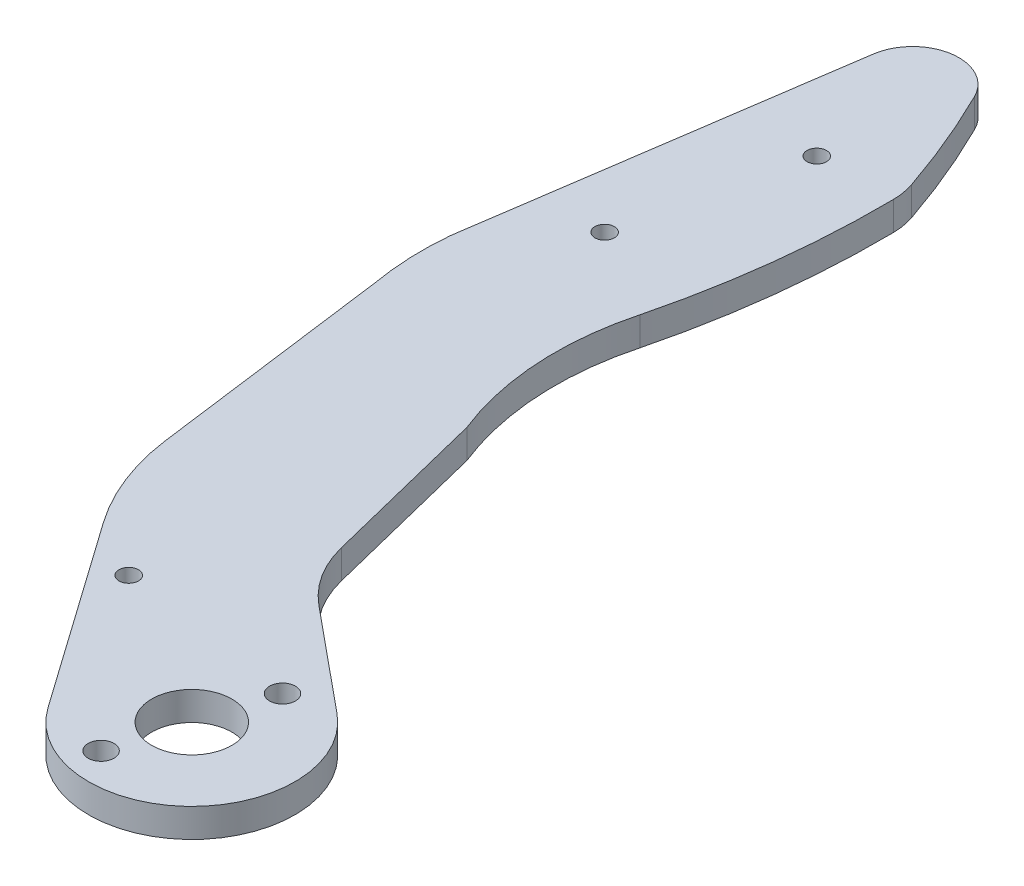
ISO-10303-21;
HEADER;
FILE_DESCRIPTION(('STEP AP214'),'2;1');
FILE_NAME('part.step','',(''),(''),'','','');
FILE_SCHEMA(('AUTOMOTIVE_DESIGN { 1 0 10303 214 1 1 1 1 }'));
ENDSEC;
DATA;
#1=APPLICATION_CONTEXT('core data for automotive mechanical design processes');
#2=APPLICATION_PROTOCOL_DEFINITION('international standard','automotive_design',2000,#1);
#3=PRODUCT_CONTEXT('',#1,'mechanical');
#4=PRODUCT('Part','Part','',(#3));
#5=PRODUCT_RELATED_PRODUCT_CATEGORY('part','',(#4));
#6=PRODUCT_DEFINITION_FORMATION('','',#4);
#7=PRODUCT_DEFINITION_CONTEXT('part definition',#1,'design');
#8=PRODUCT_DEFINITION('design','',#6,#7);
#9=PRODUCT_DEFINITION_SHAPE('','',#8);
#10=(LENGTH_UNIT() NAMED_UNIT(*) SI_UNIT(.MILLI.,.METRE.));
#11=(NAMED_UNIT(*) PLANE_ANGLE_UNIT() SI_UNIT($,.RADIAN.));
#12=(NAMED_UNIT(*) SI_UNIT($,.STERADIAN.) SOLID_ANGLE_UNIT());
#13=UNCERTAINTY_MEASURE_WITH_UNIT(LENGTH_MEASURE(1.E-05),#10,'distance_accuracy_value','');
#14=(GEOMETRIC_REPRESENTATION_CONTEXT(3) GLOBAL_UNCERTAINTY_ASSIGNED_CONTEXT((#13)) GLOBAL_UNIT_ASSIGNED_CONTEXT((#10,
#11,#12)) REPRESENTATION_CONTEXT('',''));
#15=CARTESIAN_POINT('',(0.,0.,0.));
#16=DIRECTION('',(0.,0.,1.));
#17=DIRECTION('',(1.,0.,0.));
#18=AXIS2_PLACEMENT_3D('',#15,#16,#17);
#19=CARTESIAN_POINT('',(0.,5.,0.));
#20=DIRECTION('',(0.,-1.,0.));
#21=DIRECTION('',(0.,0.,-1.));
#22=AXIS2_PLACEMENT_3D('',#19,#20,#21);
#23=PLANE('',#22);
#24=CARTESIAN_POINT('',(-3.58535968363596,5.,12.2355096313541));
#25=DIRECTION('',(0.,1.,0.));
#26=DIRECTION('',(0.,0.,1.));
#27=AXIS2_PLACEMENT_3D('',#24,#25,#26);
#28=CIRCLE('',#27,2.24999999999999);
#29=CARTESIAN_POINT('',(-3.58535968363596,5.,14.485509631354));
#30=VERTEX_POINT('',#29);
#31=EDGE_CURVE('E322',#30,#30,#28,.T.);
#32=ORIENTED_EDGE('',*,*,#31,.F.);
#33=EDGE_LOOP('',(#32));
#34=FACE_BOUND('',#33,.T.);
#35=CARTESIAN_POINT('',(3.58535968363595,5.,-12.2355096313541));
#36=DIRECTION('',(0.,1.,0.));
#37=DIRECTION('',(0.,0.,1.));
#38=AXIS2_PLACEMENT_3D('',#35,#36,#37);
#39=CIRCLE('',#38,2.24999999999999);
#40=CARTESIAN_POINT('',(3.58535968363595,5.,-9.98550963135407));
#41=VERTEX_POINT('',#40);
#42=EDGE_CURVE('E324',#41,#41,#39,.T.);
#43=ORIENTED_EDGE('',*,*,#42,.F.);
#44=EDGE_LOOP('',(#43));
#45=FACE_BOUND('',#44,.T.);
#46=CARTESIAN_POINT('',(-31.,5.,-140.));
#47=DIRECTION('',(0.,1.,0.));
#48=DIRECTION('',(0.,0.,1.));
#49=AXIS2_PLACEMENT_3D('',#46,#47,#48);
#50=CIRCLE('',#49,1.7);
#51=CARTESIAN_POINT('',(-31.,5.,-138.3));
#52=VERTEX_POINT('',#51);
#53=EDGE_CURVE('E333',#52,#52,#50,.T.);
#54=ORIENTED_EDGE('',*,*,#53,.F.);
#55=EDGE_LOOP('',(#54));
#56=FACE_BOUND('',#55,.T.);
#57=CARTESIAN_POINT('',(-38.,5.,-110.));
#58=DIRECTION('',(0.,1.,0.));
#59=DIRECTION('',(0.,0.,1.));
#60=AXIS2_PLACEMENT_3D('',#57,#58,#59);
#61=CIRCLE('',#60,1.7);
#62=CARTESIAN_POINT('',(-38.,5.,-108.3));
#63=VERTEX_POINT('',#62);
#64=EDGE_CURVE('E340',#63,#63,#61,.T.);
#65=ORIENTED_EDGE('',*,*,#64,.F.);
#66=EDGE_LOOP('',(#65));
#67=FACE_BOUND('',#66,.T.);
#68=CARTESIAN_POINT('',(0.,5.,0.));
#69=DIRECTION('',(0.,1.,0.));
#70=DIRECTION('',(0.,0.,-1.));
#71=AXIS2_PLACEMENT_3D('',#68,#69,#70);
#72=CIRCLE('',#71,18.);
#73=CARTESIAN_POINT('',(-14.7090417206775,5.,10.3751670665763));
#74=VERTEX_POINT('',#73);
#75=CARTESIAN_POINT('',(11.4464775057828,5.,-13.8916576660098));
#76=VERTEX_POINT('',#75);
#77=EDGE_CURVE('E196',#74,#76,#72,.T.);
#78=ORIENTED_EDGE('',*,*,#77,.T.);
#79=DIRECTION('',(-0.771758759222768,0.,-0.635915416987931));
#80=VECTOR('',#79,1.);
#81=CARTESIAN_POINT('',(11.4464775057828,5.,-13.8916576660098));
#82=LINE('',#81,#80);
#83=CARTESIAN_POINT('',(-6.60695362920451,5.,-28.7673620892809));
#84=VERTEX_POINT('',#83);
#85=EDGE_CURVE('E114',#76,#84,#82,.T.);
#86=ORIENTED_EDGE('',*,*,#85,.T.);
#87=CARTESIAN_POINT('',(6.11135471055411,5.,-44.2025372737363));
#88=DIRECTION('',(0.,-1.,0.));
#89=DIRECTION('',(0.,0.,-1.));
#90=AXIS2_PLACEMENT_3D('',#87,#88,#89);
#91=CIRCLE('',#90,20.);
#92=CARTESIAN_POINT('',(-13.2989437963698,5.,-39.381716609979));
#93=VERTEX_POINT('',#92);
#94=EDGE_CURVE('E229',#84,#93,#91,.T.);
#95=ORIENTED_EDGE('',*,*,#94,.T.);
#96=DIRECTION('',(-0.241041033187863,0.,-0.970514925346193));
#97=VECTOR('',#96,1.);
#98=CARTESIAN_POINT('',(-13.2989437963698,5.,-39.381716609979));
#99=LINE('',#98,#97);
#100=CARTESIAN_POINT('',(-20.5301747920056,5.,-68.4971643703648));
#101=VERTEX_POINT('',#100);
#102=EDGE_CURVE('E248',#93,#101,#99,.T.);
#103=ORIENTED_EDGE('',*,*,#102,.T.);
#104=CARTESIAN_POINT('',(26.9937980567859,5.,-87.4580042567529));
#105=DIRECTION('',(0.,-1.,0.));
#106=DIRECTION('',(0.,0.,1.));
#107=AXIS2_PLACEMENT_3D('',#104,#105,#106);
#108=CIRCLE('',#107,51.1668002178163);
#109=CARTESIAN_POINT('',(-22.4565511628832,5.,-100.599709115054));
#110=VERTEX_POINT('',#109);
#111=EDGE_CURVE('E245',#101,#110,#108,.T.);
#112=ORIENTED_EDGE('',*,*,#111,.T.);
#113=CARTESIAN_POINT('',(-171.2572125516,5.,-138.292363187831));
#114=DIRECTION('',(0.,1.,0.));
#115=DIRECTION('',(0.,0.,1.));
#116=AXIS2_PLACEMENT_3D('',#113,#114,#115);
#117=CIRCLE('',#116,153.500400653449);
#118=CARTESIAN_POINT('',(-17.7680269599981,5.,-140.147870449029));
#119=VERTEX_POINT('',#118);
#120=EDGE_CURVE('E247',#110,#119,#117,.T.);
#121=ORIENTED_EDGE('',*,*,#120,.T.);
#122=CARTESIAN_POINT('',(-30.,5.,-140.));
#123=DIRECTION('',(0.,1.,0.));
#124=DIRECTION('',(0.,0.,1.));
#125=AXIS2_PLACEMENT_3D('',#122,#123,#124);
#126=CIRCLE('',#125,12.2328667989573);
#127=CARTESIAN_POINT('',(-18.4178287610431,5.,-143.93653902718));
#128=VERTEX_POINT('',#127);
#129=EDGE_CURVE('E250',#119,#128,#126,.T.);
#130=ORIENTED_EDGE('',*,*,#129,.T.);
#131=CARTESIAN_POINT('',(-163.753174500954,5.,-94.5400788358876));
#132=DIRECTION('',(0.,1.,0.));
#133=DIRECTION('',(0.,0.,1.));
#134=AXIS2_PLACEMENT_3D('',#131,#132,#133);
#135=CIRCLE('',#134,153.500400653449);
#136=CARTESIAN_POINT('',(-26.2562949035577,5.,-162.782156044517));
#137=VERTEX_POINT('',#136);
#138=EDGE_CURVE('E256',#128,#137,#135,.T.);
#139=ORIENTED_EDGE('',*,*,#138,.T.);
#140=CARTESIAN_POINT('',(-33.4913170526785,5.,-159.191289535021));
#141=DIRECTION('',(0.,1.,0.));
#142=DIRECTION('',(0.,0.,1.));
#143=AXIS2_PLACEMENT_3D('',#140,#141,#142);
#144=CIRCLE('',#143,8.0771200181305);
#145=CARTESIAN_POINT('',(-41.4826176844214,5.,-160.365590178123));
#146=VERTEX_POINT('',#145);
#147=EDGE_CURVE('E258',#137,#146,#144,.T.);
#148=ORIENTED_EDGE('',*,*,#147,.T.);
#149=DIRECTION('',(-0.145386058454699,0.,0.989375001709163));
#150=VECTOR('',#149,1.);
#151=CARTESIAN_POINT('',(-41.4826176844214,5.,-160.365590178123));
#152=LINE('',#151,#150);
#153=CARTESIAN_POINT('',(-50.9327114839769,5.,-96.0562150670269));
#154=VERTEX_POINT('',#153);
#155=EDGE_CURVE('E260',#146,#154,#152,.T.);
#156=ORIENTED_EDGE('',*,*,#155,.T.);
#157=CARTESIAN_POINT('',(0.00716740026227708,5.,-91.2426733575386));
#158=DIRECTION('',(0.,1.,0.));
#159=DIRECTION('',(0.,0.,1.));
#160=AXIS2_PLACEMENT_3D('',#157,#158,#159);
#161=CIRCLE('',#160,51.1668002178164);
#162=CARTESIAN_POINT('',(-50.3834749970696,5.,-82.3643512573803));
#163=VERTEX_POINT('',#162);
#164=EDGE_CURVE('E151',#154,#163,#161,.T.);
#165=ORIENTED_EDGE('',*,*,#164,.T.);
#166=DIRECTION('',(0.130981717678106,0.,0.991384783842325));
#167=VECTOR('',#166,1.);
#168=CARTESIAN_POINT('',(-50.3834749970696,5.,-82.3643512573803));
#169=LINE('',#168,#167);
#170=CARTESIAN_POINT('',(-44.8192942270945,5.,-40.2497397857414));
#171=VERTEX_POINT('',#170);
#172=EDGE_CURVE('E145',#163,#171,#169,.T.);
#173=ORIENTED_EDGE('',*,*,#172,.T.);
#174=CARTESIAN_POINT('',(-5.16390287340153,5.,-45.4890084928656));
#175=DIRECTION('',(0.,1.,0.));
#176=DIRECTION('',(0.,0.,1.));
#177=AXIS2_PLACEMENT_3D('',#174,#175,#176);
#178=CIRCLE('',#177,40.);
#179=CARTESIAN_POINT('',(-37.8506622526848,5.,-22.4330816782516));
#180=VERTEX_POINT('',#179);
#181=EDGE_CURVE('E149',#171,#180,#178,.T.);
#182=ORIENTED_EDGE('',*,*,#181,.T.);
#183=DIRECTION('',(0.576398170365351,0.,0.817168984482081));
#184=VECTOR('',#183,1.);
#185=CARTESIAN_POINT('',(-37.8506622526848,5.,-22.4330816782516));
#186=LINE('',#185,#184);
#187=EDGE_CURVE('E53',#180,#74,#186,.T.);
#188=ORIENTED_EDGE('',*,*,#187,.T.);
#189=EDGE_LOOP('',(#78,#86,#95,#103,#112,#121,#130,#139,#148,#156,#165,#173,#182,#188));
#190=FACE_BOUND('',#189,.T.);
#191=CARTESIAN_POINT('',(0.,5.,0.));
#192=DIRECTION('',(0.,1.,0.));
#193=DIRECTION('',(0.,0.,1.));
#194=AXIS2_PLACEMENT_3D('',#191,#192,#193);
#195=CIRCLE('',#194,7.);
#196=CARTESIAN_POINT('',(0.,5.,7.));
#197=VERTEX_POINT('',#196);
#198=EDGE_CURVE('E173',#197,#197,#195,.T.);
#199=ORIENTED_EDGE('',*,*,#198,.F.);
#200=EDGE_LOOP('',(#199));
#201=FACE_BOUND('',#200,.T.);
#202=CARTESIAN_POINT('',(-27.6732846118374,5.,-16.6790083276029));
#203=DIRECTION('',(0.,1.,0.));
#204=DIRECTION('',(0.,0.,1.));
#205=AXIS2_PLACEMENT_3D('',#202,#203,#204);
#206=CIRCLE('',#205,1.7);
#207=CARTESIAN_POINT('',(-27.6732846118374,5.,-14.9790083276029));
#208=VERTEX_POINT('',#207);
#209=EDGE_CURVE('E345',#208,#208,#206,.T.);
#210=ORIENTED_EDGE('',*,*,#209,.F.);
#211=EDGE_LOOP('',(#210));
#212=FACE_BOUND('',#211,.T.);
#213=ADVANCED_FACE('F36',(#34,#45,#56,#67,#190,#201,#212),#23,.F.);
#214=CARTESIAN_POINT('',(0.,0.,0.));
#215=DIRECTION('',(0.,-1.,0.));
#216=DIRECTION('',(0.,0.,-1.));
#217=AXIS2_PLACEMENT_3D('',#214,#215,#216);
#218=PLANE('',#217);
#219=CARTESIAN_POINT('',(-3.58535968363596,0.,12.2355096313541));
#220=DIRECTION('',(0.,-1.,0.));
#221=DIRECTION('',(0.,0.,-1.));
#222=AXIS2_PLACEMENT_3D('',#219,#220,#221);
#223=CIRCLE('',#222,2.24999999999999);
#224=CARTESIAN_POINT('',(-3.58535968363596,0.,9.98550963135407));
#225=VERTEX_POINT('',#224);
#226=EDGE_CURVE('E320',#225,#225,#223,.T.);
#227=ORIENTED_EDGE('',*,*,#226,.F.);
#228=EDGE_LOOP('',(#227));
#229=FACE_BOUND('',#228,.T.);
#230=CARTESIAN_POINT('',(3.58535968363595,0.,-12.2355096313541));
#231=DIRECTION('',(0.,-1.,0.));
#232=DIRECTION('',(0.,0.,-1.));
#233=AXIS2_PLACEMENT_3D('',#230,#231,#232);
#234=CIRCLE('',#233,2.24999999999999);
#235=CARTESIAN_POINT('',(3.58535968363595,0.,-14.485509631354));
#236=VERTEX_POINT('',#235);
#237=EDGE_CURVE('E329',#236,#236,#234,.T.);
#238=ORIENTED_EDGE('',*,*,#237,.F.);
#239=EDGE_LOOP('',(#238));
#240=FACE_BOUND('',#239,.T.);
#241=CARTESIAN_POINT('',(-31.,0.,-140.));
#242=DIRECTION('',(0.,-1.,0.));
#243=DIRECTION('',(0.,0.,-1.));
#244=AXIS2_PLACEMENT_3D('',#241,#242,#243);
#245=CIRCLE('',#244,1.7);
#246=CARTESIAN_POINT('',(-31.,0.,-141.7));
#247=VERTEX_POINT('',#246);
#248=EDGE_CURVE('E337',#247,#247,#245,.F.);
#249=ORIENTED_EDGE('',*,*,#248,.T.);
#250=EDGE_LOOP('',(#249));
#251=FACE_BOUND('',#250,.T.);
#252=CARTESIAN_POINT('',(-38.,0.,-110.));
#253=DIRECTION('',(0.,-1.,0.));
#254=DIRECTION('',(0.,0.,-1.));
#255=AXIS2_PLACEMENT_3D('',#252,#253,#254);
#256=CIRCLE('',#255,1.7);
#257=CARTESIAN_POINT('',(-38.,0.,-111.7));
#258=VERTEX_POINT('',#257);
#259=EDGE_CURVE('E332',#258,#258,#256,.F.);
#260=ORIENTED_EDGE('',*,*,#259,.T.);
#261=EDGE_LOOP('',(#260));
#262=FACE_BOUND('',#261,.T.);
#263=CARTESIAN_POINT('',(0.,0.,0.));
#264=DIRECTION('',(0.,1.,0.));
#265=DIRECTION('',(0.,0.,1.));
#266=AXIS2_PLACEMENT_3D('',#263,#264,#265);
#267=CIRCLE('',#266,7.);
#268=CARTESIAN_POINT('',(0.,0.,7.));
#269=VERTEX_POINT('',#268);
#270=EDGE_CURVE('E348',#269,#269,#267,.T.);
#271=ORIENTED_EDGE('',*,*,#270,.T.);
#272=EDGE_LOOP('',(#271));
#273=FACE_BOUND('',#272,.T.);
#274=CARTESIAN_POINT('',(0.,0.,0.));
#275=DIRECTION('',(0.,1.,0.));
#276=DIRECTION('',(0.,0.,-1.));
#277=AXIS2_PLACEMENT_3D('',#274,#275,#276);
#278=CIRCLE('',#277,18.);
#279=CARTESIAN_POINT('',(-14.7090417206775,0.,10.3751670665763));
#280=VERTEX_POINT('',#279);
#281=CARTESIAN_POINT('',(11.4464775057828,0.,-13.8916576660098));
#282=VERTEX_POINT('',#281);
#283=EDGE_CURVE('E169',#280,#282,#278,.T.);
#284=ORIENTED_EDGE('',*,*,#283,.F.);
#285=DIRECTION('',(0.576398170365351,0.,0.817168984482081));
#286=VECTOR('',#285,1.);
#287=CARTESIAN_POINT('',(-37.8506622526848,0.,-22.4330816782516));
#288=LINE('',#287,#286);
#289=CARTESIAN_POINT('',(-37.8506622526848,0.,-22.4330816782516));
#290=VERTEX_POINT('',#289);
#291=EDGE_CURVE('E106',#290,#280,#288,.T.);
#292=ORIENTED_EDGE('',*,*,#291,.F.);
#293=CARTESIAN_POINT('',(-5.16390287340153,0.,-45.4890084928656));
#294=DIRECTION('',(0.,1.,0.));
#295=DIRECTION('',(0.,0.,1.));
#296=AXIS2_PLACEMENT_3D('',#293,#294,#295);
#297=CIRCLE('',#296,40.);
#298=CARTESIAN_POINT('',(-44.8192942270945,0.,-40.2497397857414));
#299=VERTEX_POINT('',#298);
#300=EDGE_CURVE('E100',#299,#290,#297,.T.);
#301=ORIENTED_EDGE('',*,*,#300,.F.);
#302=DIRECTION('',(0.130981717678106,0.,0.991384783842325));
#303=VECTOR('',#302,1.);
#304=CARTESIAN_POINT('',(-50.3834749970696,0.,-82.3643512573803));
#305=LINE('',#304,#303);
#306=CARTESIAN_POINT('',(-50.3834749970696,0.,-82.3643512573803));
#307=VERTEX_POINT('',#306);
#308=EDGE_CURVE('E159',#307,#299,#305,.T.);
#309=ORIENTED_EDGE('',*,*,#308,.F.);
#310=CARTESIAN_POINT('',(0.00716740026227708,0.,-91.2426733575386));
#311=DIRECTION('',(0.,1.,0.));
#312=DIRECTION('',(0.,0.,1.));
#313=AXIS2_PLACEMENT_3D('',#310,#311,#312);
#314=CIRCLE('',#313,51.1668002178164);
#315=CARTESIAN_POINT('',(-50.9327114839769,0.,-96.0562150670269));
#316=VERTEX_POINT('',#315);
#317=EDGE_CURVE('E191',#316,#307,#314,.T.);
#318=ORIENTED_EDGE('',*,*,#317,.F.);
#319=DIRECTION('',(-0.145386058454699,0.,0.989375001709163));
#320=VECTOR('',#319,1.);
#321=CARTESIAN_POINT('',(-41.4826176844214,0.,-160.365590178123));
#322=LINE('',#321,#320);
#323=CARTESIAN_POINT('',(-41.4826176844214,0.,-160.365590178123));
#324=VERTEX_POINT('',#323);
#325=EDGE_CURVE('E189',#324,#316,#322,.T.);
#326=ORIENTED_EDGE('',*,*,#325,.F.);
#327=CARTESIAN_POINT('',(-33.4913170526785,0.,-159.191289535021));
#328=DIRECTION('',(0.,1.,0.));
#329=DIRECTION('',(0.,0.,1.));
#330=AXIS2_PLACEMENT_3D('',#327,#328,#329);
#331=CIRCLE('',#330,8.0771200181305);
#332=CARTESIAN_POINT('',(-26.2562949035577,0.,-162.782156044517));
#333=VERTEX_POINT('',#332);
#334=EDGE_CURVE('E187',#333,#324,#331,.T.);
#335=ORIENTED_EDGE('',*,*,#334,.F.);
#336=CARTESIAN_POINT('',(-163.753174500954,0.,-94.5400788358876));
#337=DIRECTION('',(0.,1.,0.));
#338=DIRECTION('',(0.,0.,1.));
#339=AXIS2_PLACEMENT_3D('',#336,#337,#338);
#340=CIRCLE('',#339,153.500400653449);
#341=CARTESIAN_POINT('',(-18.4178287610431,0.,-143.93653902718));
#342=VERTEX_POINT('',#341);
#343=EDGE_CURVE('E185',#342,#333,#340,.T.);
#344=ORIENTED_EDGE('',*,*,#343,.F.);
#345=CARTESIAN_POINT('',(-30.,0.,-140.));
#346=DIRECTION('',(0.,1.,0.));
#347=DIRECTION('',(0.,0.,1.));
#348=AXIS2_PLACEMENT_3D('',#345,#346,#347);
#349=CIRCLE('',#348,12.2328667989573);
#350=CARTESIAN_POINT('',(-17.7680269599981,0.,-140.147870449029));
#351=VERTEX_POINT('',#350);
#352=EDGE_CURVE('E183',#351,#342,#349,.T.);
#353=ORIENTED_EDGE('',*,*,#352,.F.);
#354=CARTESIAN_POINT('',(-171.2572125516,0.,-138.292363187831));
#355=DIRECTION('',(0.,1.,0.));
#356=DIRECTION('',(0.,0.,1.));
#357=AXIS2_PLACEMENT_3D('',#354,#355,#356);
#358=CIRCLE('',#357,153.500400653449);
#359=CARTESIAN_POINT('',(-22.4565511628832,0.,-100.599709115054));
#360=VERTEX_POINT('',#359);
#361=EDGE_CURVE('E181',#360,#351,#358,.T.);
#362=ORIENTED_EDGE('',*,*,#361,.F.);
#363=CARTESIAN_POINT('',(26.9937980567859,0.,-87.4580042567529));
#364=DIRECTION('',(0.,-1.,0.));
#365=DIRECTION('',(0.,0.,1.));
#366=AXIS2_PLACEMENT_3D('',#363,#364,#365);
#367=CIRCLE('',#366,51.1668002178163);
#368=CARTESIAN_POINT('',(-20.5301747920056,0.,-68.4971643703648));
#369=VERTEX_POINT('',#368);
#370=EDGE_CURVE('E179',#369,#360,#367,.T.);
#371=ORIENTED_EDGE('',*,*,#370,.F.);
#372=DIRECTION('',(-0.241041033187863,0.,-0.970514925346193));
#373=VECTOR('',#372,1.);
#374=CARTESIAN_POINT('',(-13.2989437963698,0.,-39.381716609979));
#375=LINE('',#374,#373);
#376=CARTESIAN_POINT('',(-13.2989437963698,0.,-39.381716609979));
#377=VERTEX_POINT('',#376);
#378=EDGE_CURVE('E177',#377,#369,#375,.T.);
#379=ORIENTED_EDGE('',*,*,#378,.F.);
#380=CARTESIAN_POINT('',(6.11135471055411,0.,-44.2025372737363));
#381=DIRECTION('',(0.,-1.,0.));
#382=DIRECTION('',(0.,0.,-1.));
#383=AXIS2_PLACEMENT_3D('',#380,#381,#382);
#384=CIRCLE('',#383,20.);
#385=CARTESIAN_POINT('',(-6.60695362920451,0.,-28.7673620892809));
#386=VERTEX_POINT('',#385);
#387=EDGE_CURVE('E175',#386,#377,#384,.T.);
#388=ORIENTED_EDGE('',*,*,#387,.F.);
#389=DIRECTION('',(-0.771758759222768,0.,-0.635915416987931));
#390=VECTOR('',#389,1.);
#391=CARTESIAN_POINT('',(11.4464775057828,0.,-13.8916576660098));
#392=LINE('',#391,#390);
#393=EDGE_CURVE('E172',#282,#386,#392,.T.);
#394=ORIENTED_EDGE('',*,*,#393,.F.);
#395=EDGE_LOOP('',(#284,#292,#301,#309,#318,#326,#335,#344,#353,#362,#371,#379,#388,#394));
#396=FACE_BOUND('',#395,.T.);
#397=CARTESIAN_POINT('',(-27.6732846118374,0.,-16.6790083276029));
#398=DIRECTION('',(0.,1.,0.));
#399=DIRECTION('',(0.,0.,1.));
#400=AXIS2_PLACEMENT_3D('',#397,#398,#399);
#401=CIRCLE('',#400,1.7);
#402=CARTESIAN_POINT('',(-27.6732846118374,0.,-14.9790083276029));
#403=VERTEX_POINT('',#402);
#404=EDGE_CURVE('E336',#403,#403,#401,.T.);
#405=ORIENTED_EDGE('',*,*,#404,.T.);
#406=EDGE_LOOP('',(#405));
#407=FACE_BOUND('',#406,.T.);
#408=ADVANCED_FACE('F233',(#229,#240,#251,#262,#273,#396,#407),#218,.T.);
#409=CARTESIAN_POINT('',(0.,5.,0.));
#410=DIRECTION('',(0.,-1.,0.));
#411=DIRECTION('',(0.,0.,-1.));
#412=AXIS2_PLACEMENT_3D('',#409,#410,#411);
#413=CYLINDRICAL_SURFACE('',#412,18.);
#414=ORIENTED_EDGE('',*,*,#283,.T.);
#415=DIRECTION('',(0.,-1.,0.));
#416=VECTOR('',#415,1.);
#417=CARTESIAN_POINT('',(11.4464775057828,5.,-13.8916576660098));
#418=LINE('',#417,#416);
#419=EDGE_CURVE('E11',#76,#282,#418,.T.);
#420=ORIENTED_EDGE('',*,*,#419,.F.);
#421=ORIENTED_EDGE('',*,*,#77,.F.);
#422=DIRECTION('',(0.,-1.,0.));
#423=VECTOR('',#422,1.);
#424=CARTESIAN_POINT('',(-14.7090417206775,5.,10.3751670665763));
#425=LINE('',#424,#423);
#426=EDGE_CURVE('E165',#74,#280,#425,.T.);
#427=ORIENTED_EDGE('',*,*,#426,.T.);
#428=EDGE_LOOP('',(#414,#420,#421,#427));
#429=FACE_BOUND('',#428,.T.);
#430=ADVANCED_FACE('F38',(#429),#413,.T.);
#431=CARTESIAN_POINT('',(11.4464775057828,5.,-13.8916576660098));
#432=DIRECTION('',(-0.635915416987931,0.,0.771758759222768));
#433=DIRECTION('',(0.771758759222768,0.,0.635915416987931));
#434=AXIS2_PLACEMENT_3D('',#431,#432,#433);
#435=PLANE('',#434);
#436=ORIENTED_EDGE('',*,*,#393,.T.);
#437=DIRECTION('',(0.,-1.,0.));
#438=VECTOR('',#437,1.);
#439=CARTESIAN_POINT('',(-6.60695362920451,5.,-28.7673620892809));
#440=LINE('',#439,#438);
#441=EDGE_CURVE('E45',#84,#386,#440,.T.);
#442=ORIENTED_EDGE('',*,*,#441,.F.);
#443=ORIENTED_EDGE('',*,*,#85,.F.);
#444=ORIENTED_EDGE('',*,*,#419,.T.);
#445=EDGE_LOOP('',(#436,#442,#443,#444));
#446=FACE_BOUND('',#445,.T.);
#447=ADVANCED_FACE('F499',(#446),#435,.F.);
#448=CARTESIAN_POINT('',(6.11135471055411,5.,-44.2025372737363));
#449=DIRECTION('',(0.,-1.,0.));
#450=DIRECTION('',(0.,0.,-1.));
#451=AXIS2_PLACEMENT_3D('',#448,#449,#450);
#452=CYLINDRICAL_SURFACE('',#451,20.);
#453=ORIENTED_EDGE('',*,*,#387,.T.);
#454=DIRECTION('',(0.,-1.,0.));
#455=VECTOR('',#454,1.);
#456=CARTESIAN_POINT('',(-13.2989437963698,5.,-39.381716609979));
#457=LINE('',#456,#455);
#458=EDGE_CURVE('E221',#93,#377,#457,.T.);
#459=ORIENTED_EDGE('',*,*,#458,.F.);
#460=ORIENTED_EDGE('',*,*,#94,.F.);
#461=ORIENTED_EDGE('',*,*,#441,.T.);
#462=EDGE_LOOP('',(#453,#459,#460,#461));
#463=FACE_BOUND('',#462,.T.);
#464=ADVANCED_FACE('F227',(#463),#452,.F.);
#465=CARTESIAN_POINT('',(-13.2989437963698,5.,-39.381716609979));
#466=DIRECTION('',(-0.970514925346193,0.,0.241041033187863));
#467=DIRECTION('',(0.241041033187863,0.,0.970514925346194));
#468=AXIS2_PLACEMENT_3D('',#465,#466,#467);
#469=PLANE('',#468);
#470=ORIENTED_EDGE('',*,*,#378,.T.);
#471=DIRECTION('',(0.,-1.,0.));
#472=VECTOR('',#471,1.);
#473=CARTESIAN_POINT('',(-20.5301747920056,5.,-68.4971643703648));
#474=LINE('',#473,#472);
#475=EDGE_CURVE('E218',#101,#369,#474,.T.);
#476=ORIENTED_EDGE('',*,*,#475,.F.);
#477=ORIENTED_EDGE('',*,*,#102,.F.);
#478=ORIENTED_EDGE('',*,*,#458,.T.);
#479=EDGE_LOOP('',(#470,#476,#477,#478));
#480=FACE_BOUND('',#479,.T.);
#481=ADVANCED_FACE('F239',(#480),#469,.F.);
#482=CARTESIAN_POINT('',(26.9937980567859,5.,-87.4580042567529));
#483=DIRECTION('',(0.,-1.,0.));
#484=DIRECTION('',(0.,0.,-1.));
#485=AXIS2_PLACEMENT_3D('',#482,#483,#484);
#486=CYLINDRICAL_SURFACE('',#485,51.1668002178163);
#487=ORIENTED_EDGE('',*,*,#370,.T.);
#488=DIRECTION('',(0.,-1.,0.));
#489=VECTOR('',#488,1.);
#490=CARTESIAN_POINT('',(-22.4565511628832,5.,-100.599709115054));
#491=LINE('',#490,#489);
#492=EDGE_CURVE('E215',#110,#360,#491,.T.);
#493=ORIENTED_EDGE('',*,*,#492,.F.);
#494=ORIENTED_EDGE('',*,*,#111,.F.);
#495=ORIENTED_EDGE('',*,*,#475,.T.);
#496=EDGE_LOOP('',(#487,#493,#494,#495));
#497=FACE_BOUND('',#496,.T.);
#498=ADVANCED_FACE('F243',(#497),#486,.F.);
#499=CARTESIAN_POINT('',(-171.2572125516,5.,-138.292363187831));
#500=DIRECTION('',(0.,-1.,0.));
#501=DIRECTION('',(0.,0.,-1.));
#502=AXIS2_PLACEMENT_3D('',#499,#500,#501);
#503=CYLINDRICAL_SURFACE('',#502,153.500400653449);
#504=ORIENTED_EDGE('',*,*,#361,.T.);
#505=DIRECTION('',(0.,-1.,0.));
#506=VECTOR('',#505,1.);
#507=CARTESIAN_POINT('',(-17.7680269599981,5.,-140.147870449029));
#508=LINE('',#507,#506);
#509=EDGE_CURVE('E212',#119,#351,#508,.T.);
#510=ORIENTED_EDGE('',*,*,#509,.F.);
#511=ORIENTED_EDGE('',*,*,#120,.F.);
#512=ORIENTED_EDGE('',*,*,#492,.T.);
#513=EDGE_LOOP('',(#504,#510,#511,#512));
#514=FACE_BOUND('',#513,.T.);
#515=ADVANCED_FACE('F464',(#514),#503,.T.);
#516=CARTESIAN_POINT('',(-30.,5.,-140.));
#517=DIRECTION('',(0.,-1.,0.));
#518=DIRECTION('',(0.,0.,-1.));
#519=AXIS2_PLACEMENT_3D('',#516,#517,#518);
#520=CYLINDRICAL_SURFACE('',#519,12.2328667989573);
#521=ORIENTED_EDGE('',*,*,#352,.T.);
#522=DIRECTION('',(0.,-1.,0.));
#523=VECTOR('',#522,1.);
#524=CARTESIAN_POINT('',(-18.4178287610431,5.,-143.93653902718));
#525=LINE('',#524,#523);
#526=EDGE_CURVE('E209',#128,#342,#525,.T.);
#527=ORIENTED_EDGE('',*,*,#526,.F.);
#528=ORIENTED_EDGE('',*,*,#129,.F.);
#529=ORIENTED_EDGE('',*,*,#509,.T.);
#530=EDGE_LOOP('',(#521,#527,#528,#529));
#531=FACE_BOUND('',#530,.T.);
#532=ADVANCED_FACE('F454',(#531),#520,.T.);
#533=CARTESIAN_POINT('',(-163.753174500954,5.,-94.5400788358876));
#534=DIRECTION('',(0.,-1.,0.));
#535=DIRECTION('',(0.,0.,-1.));
#536=AXIS2_PLACEMENT_3D('',#533,#534,#535);
#537=CYLINDRICAL_SURFACE('',#536,153.500400653449);
#538=ORIENTED_EDGE('',*,*,#343,.T.);
#539=DIRECTION('',(0.,-1.,0.));
#540=VECTOR('',#539,1.);
#541=CARTESIAN_POINT('',(-26.2562949035577,5.,-162.782156044517));
#542=LINE('',#541,#540);
#543=EDGE_CURVE('E206',#137,#333,#542,.T.);
#544=ORIENTED_EDGE('',*,*,#543,.F.);
#545=ORIENTED_EDGE('',*,*,#138,.F.);
#546=ORIENTED_EDGE('',*,*,#526,.T.);
#547=EDGE_LOOP('',(#538,#544,#545,#546));
#548=FACE_BOUND('',#547,.T.);
#549=ADVANCED_FACE('F444',(#548),#537,.T.);
#550=CARTESIAN_POINT('',(-33.4913170526785,5.,-159.191289535021));
#551=DIRECTION('',(0.,-1.,0.));
#552=DIRECTION('',(0.,0.,-1.));
#553=AXIS2_PLACEMENT_3D('',#550,#551,#552);
#554=CYLINDRICAL_SURFACE('',#553,8.0771200181305);
#555=ORIENTED_EDGE('',*,*,#334,.T.);
#556=DIRECTION('',(0.,-1.,0.));
#557=VECTOR('',#556,1.);
#558=CARTESIAN_POINT('',(-41.4826176844214,5.,-160.365590178123));
#559=LINE('',#558,#557);
#560=EDGE_CURVE('E203',#146,#324,#559,.T.);
#561=ORIENTED_EDGE('',*,*,#560,.F.);
#562=ORIENTED_EDGE('',*,*,#147,.F.);
#563=ORIENTED_EDGE('',*,*,#543,.T.);
#564=EDGE_LOOP('',(#555,#561,#562,#563));
#565=FACE_BOUND('',#564,.T.);
#566=ADVANCED_FACE('F435',(#565),#554,.T.);
#567=CARTESIAN_POINT('',(-41.4826176844214,5.,-160.365590178123));
#568=DIRECTION('',(0.989375001709163,0.,0.145386058454699));
#569=DIRECTION('',(0.145386058454699,0.,-0.989375001709163));
#570=AXIS2_PLACEMENT_3D('',#567,#568,#569);
#571=PLANE('',#570);
#572=ORIENTED_EDGE('',*,*,#325,.T.);
#573=DIRECTION('',(0.,-1.,0.));
#574=VECTOR('',#573,1.);
#575=CARTESIAN_POINT('',(-50.9327114839769,5.,-96.0562150670269));
#576=LINE('',#575,#574);
#577=EDGE_CURVE('E200',#154,#316,#576,.T.);
#578=ORIENTED_EDGE('',*,*,#577,.F.);
#579=ORIENTED_EDGE('',*,*,#155,.F.);
#580=ORIENTED_EDGE('',*,*,#560,.T.);
#581=EDGE_LOOP('',(#572,#578,#579,#580));
#582=FACE_BOUND('',#581,.T.);
#583=ADVANCED_FACE('F266',(#582),#571,.F.);
#584=CARTESIAN_POINT('',(0.00716740026227708,5.,-91.2426733575386));
#585=DIRECTION('',(0.,-1.,0.));
#586=DIRECTION('',(0.,0.,-1.));
#587=AXIS2_PLACEMENT_3D('',#584,#585,#586);
#588=CYLINDRICAL_SURFACE('',#587,51.1668002178164);
#589=ORIENTED_EDGE('',*,*,#317,.T.);
#590=DIRECTION('',(0.,-1.,0.));
#591=VECTOR('',#590,1.);
#592=CARTESIAN_POINT('',(-50.3834749970696,5.,-82.3643512573803));
#593=LINE('',#592,#591);
#594=EDGE_CURVE('E160',#163,#307,#593,.T.);
#595=ORIENTED_EDGE('',*,*,#594,.F.);
#596=ORIENTED_EDGE('',*,*,#164,.F.);
#597=ORIENTED_EDGE('',*,*,#577,.T.);
#598=EDGE_LOOP('',(#589,#595,#596,#597));
#599=FACE_BOUND('',#598,.T.);
#600=ADVANCED_FACE('F270',(#599),#588,.T.);
#601=CARTESIAN_POINT('',(-50.3834749970696,5.,-82.3643512573803));
#602=DIRECTION('',(0.991384783842325,0.,-0.130981717678106));
#603=DIRECTION('',(-0.130981717678106,0.,-0.991384783842325));
#604=AXIS2_PLACEMENT_3D('',#601,#602,#603);
#605=PLANE('',#604);
#606=ORIENTED_EDGE('',*,*,#308,.T.);
#607=DIRECTION('',(0.,-1.,0.));
#608=VECTOR('',#607,1.);
#609=CARTESIAN_POINT('',(-44.8192942270945,5.,-40.2497397857414));
#610=LINE('',#609,#608);
#611=EDGE_CURVE('E156',#171,#299,#610,.T.);
#612=ORIENTED_EDGE('',*,*,#611,.F.);
#613=ORIENTED_EDGE('',*,*,#172,.F.);
#614=ORIENTED_EDGE('',*,*,#594,.T.);
#615=EDGE_LOOP('',(#606,#612,#613,#614));
#616=FACE_BOUND('',#615,.T.);
#617=ADVANCED_FACE('F157',(#616),#605,.F.);
#618=CARTESIAN_POINT('',(-5.16390287340153,5.,-45.4890084928656));
#619=DIRECTION('',(0.,-1.,0.));
#620=DIRECTION('',(0.,0.,-1.));
#621=AXIS2_PLACEMENT_3D('',#618,#619,#620);
#622=CYLINDRICAL_SURFACE('',#621,40.);
#623=ORIENTED_EDGE('',*,*,#300,.T.);
#624=DIRECTION('',(0.,-1.,0.));
#625=VECTOR('',#624,1.);
#626=CARTESIAN_POINT('',(-37.8506622526848,5.,-22.4330816782516));
#627=LINE('',#626,#625);
#628=EDGE_CURVE('E161',#180,#290,#627,.T.);
#629=ORIENTED_EDGE('',*,*,#628,.F.);
#630=ORIENTED_EDGE('',*,*,#181,.F.);
#631=ORIENTED_EDGE('',*,*,#611,.T.);
#632=EDGE_LOOP('',(#623,#629,#630,#631));
#633=FACE_BOUND('',#632,.T.);
#634=ADVANCED_FACE('F163',(#633),#622,.T.);
#635=CARTESIAN_POINT('',(-37.8506622526848,5.,-22.4330816782516));
#636=DIRECTION('',(0.817168984482081,0.,-0.576398170365351));
#637=DIRECTION('',(-0.576398170365351,0.,-0.817168984482081));
#638=AXIS2_PLACEMENT_3D('',#635,#636,#637);
#639=PLANE('',#638);
#640=ORIENTED_EDGE('',*,*,#291,.T.);
#641=ORIENTED_EDGE('',*,*,#426,.F.);
#642=ORIENTED_EDGE('',*,*,#187,.F.);
#643=ORIENTED_EDGE('',*,*,#628,.T.);
#644=EDGE_LOOP('',(#640,#641,#642,#643));
#645=FACE_BOUND('',#644,.T.);
#646=ADVANCED_FACE('F274',(#645),#639,.F.);
#647=CARTESIAN_POINT('',(0.,5.,0.));
#648=DIRECTION('',(0.,-1.,0.));
#649=DIRECTION('',(0.,0.,-1.));
#650=AXIS2_PLACEMENT_3D('',#647,#648,#649);
#651=CYLINDRICAL_SURFACE('',#650,7.);
#652=ORIENTED_EDGE('',*,*,#198,.T.);
#653=EDGE_LOOP('',(#652));
#654=FACE_BOUND('',#653,.T.);
#655=ORIENTED_EDGE('',*,*,#270,.F.);
#656=EDGE_LOOP('',(#655));
#657=FACE_BOUND('',#656,.T.);
#658=ADVANCED_FACE('F276',(#654,#657),#651,.F.);
#659=CARTESIAN_POINT('',(-27.6732846118374,5.,-16.6790083276029));
#660=DIRECTION('',(0.,-1.,0.));
#661=DIRECTION('',(0.,0.,-1.));
#662=AXIS2_PLACEMENT_3D('',#659,#660,#661);
#663=CYLINDRICAL_SURFACE('',#662,1.7);
#664=ORIENTED_EDGE('',*,*,#209,.T.);
#665=EDGE_LOOP('',(#664));
#666=FACE_BOUND('',#665,.T.);
#667=ORIENTED_EDGE('',*,*,#404,.F.);
#668=EDGE_LOOP('',(#667));
#669=FACE_BOUND('',#668,.T.);
#670=ADVANCED_FACE('F282',(#666,#669),#663,.F.);
#671=CARTESIAN_POINT('',(-38.,-0.00100000000000013,-110.));
#672=DIRECTION('',(0.,1.,0.));
#673=DIRECTION('',(0.,0.,1.));
#674=AXIS2_PLACEMENT_3D('',#671,#672,#673);
#675=CYLINDRICAL_SURFACE('',#674,1.7);
#676=ORIENTED_EDGE('',*,*,#259,.F.);
#677=EDGE_LOOP('',(#676));
#678=FACE_BOUND('',#677,.T.);
#679=ORIENTED_EDGE('',*,*,#64,.T.);
#680=EDGE_LOOP('',(#679));
#681=FACE_BOUND('',#680,.T.);
#682=ADVANCED_FACE('F299',(#678,#681),#675,.F.);
#683=CARTESIAN_POINT('',(-31.,-0.00100000000000013,-140.));
#684=DIRECTION('',(0.,1.,0.));
#685=DIRECTION('',(0.,0.,1.));
#686=AXIS2_PLACEMENT_3D('',#683,#684,#685);
#687=CYLINDRICAL_SURFACE('',#686,1.7);
#688=ORIENTED_EDGE('',*,*,#248,.F.);
#689=EDGE_LOOP('',(#688));
#690=FACE_BOUND('',#689,.T.);
#691=ORIENTED_EDGE('',*,*,#53,.T.);
#692=EDGE_LOOP('',(#691));
#693=FACE_BOUND('',#692,.T.);
#694=ADVANCED_FACE('F303',(#690,#693),#687,.F.);
#695=CARTESIAN_POINT('',(3.58535968363595,5.,-12.2355096313541));
#696=DIRECTION('',(0.,1.,0.));
#697=DIRECTION('',(0.,0.,1.));
#698=AXIS2_PLACEMENT_3D('',#695,#696,#697);
#699=CYLINDRICAL_SURFACE('',#698,2.24999999999999);
#700=ORIENTED_EDGE('',*,*,#237,.T.);
#701=EDGE_LOOP('',(#700));
#702=FACE_BOUND('',#701,.T.);
#703=ORIENTED_EDGE('',*,*,#42,.T.);
#704=EDGE_LOOP('',(#703));
#705=FACE_BOUND('',#704,.T.);
#706=ADVANCED_FACE('F307',(#702,#705),#699,.F.);
#707=CARTESIAN_POINT('',(-3.58535968363596,5.,12.2355096313541));
#708=DIRECTION('',(0.,1.,0.));
#709=DIRECTION('',(0.,0.,1.));
#710=AXIS2_PLACEMENT_3D('',#707,#708,#709);
#711=CYLINDRICAL_SURFACE('',#710,2.24999999999999);
#712=ORIENTED_EDGE('',*,*,#226,.T.);
#713=EDGE_LOOP('',(#712));
#714=FACE_BOUND('',#713,.T.);
#715=ORIENTED_EDGE('',*,*,#31,.T.);
#716=EDGE_LOOP('',(#715));
#717=FACE_BOUND('',#716,.T.);
#718=ADVANCED_FACE('F311',(#714,#717),#711,.F.);
#719=CLOSED_SHELL('',(#213,#408,#430,#447,#464,#481,#498,#515,#532,#549,#566,#583,#600,#617,
#634,#646,#658,#670,#682,#694,#706,#718));
#720=MANIFOLD_SOLID_BREP('B2',#719);
#721=ADVANCED_BREP_SHAPE_REPRESENTATION('',(#18,#720),#14);
#722=SHAPE_DEFINITION_REPRESENTATION(#9,#721);
ENDSEC;
END-ISO-10303-21;
